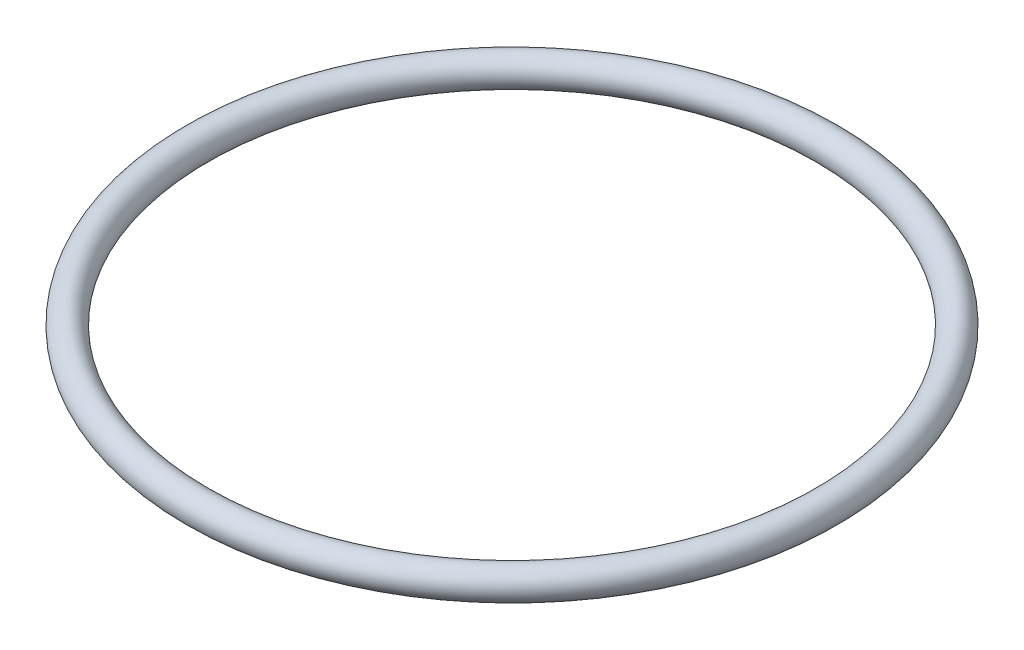
ISO-10303-21;
HEADER;
FILE_DESCRIPTION(('STEP AP214'),'2;1');
FILE_NAME('part.step','',(''),(''),'','','');
FILE_SCHEMA(('AUTOMOTIVE_DESIGN { 1 0 10303 214 1 1 1 1 }'));
ENDSEC;
DATA;
#1=APPLICATION_CONTEXT('core data for automotive mechanical design processes');
#2=APPLICATION_PROTOCOL_DEFINITION('international standard','automotive_design',2000,#1);
#3=PRODUCT_CONTEXT('',#1,'mechanical');
#4=PRODUCT('Part','Part','',(#3));
#5=PRODUCT_RELATED_PRODUCT_CATEGORY('part','',(#4));
#6=PRODUCT_DEFINITION_FORMATION('','',#4);
#7=PRODUCT_DEFINITION_CONTEXT('part definition',#1,'design');
#8=PRODUCT_DEFINITION('design','',#6,#7);
#9=PRODUCT_DEFINITION_SHAPE('','',#8);
#10=(LENGTH_UNIT() NAMED_UNIT(*) SI_UNIT(.MILLI.,.METRE.));
#11=(NAMED_UNIT(*) PLANE_ANGLE_UNIT() SI_UNIT($,.RADIAN.));
#12=(NAMED_UNIT(*) SI_UNIT($,.STERADIAN.) SOLID_ANGLE_UNIT());
#13=UNCERTAINTY_MEASURE_WITH_UNIT(LENGTH_MEASURE(1.E-05),#10,'distance_accuracy_value','');
#14=(GEOMETRIC_REPRESENTATION_CONTEXT(3) GLOBAL_UNCERTAINTY_ASSIGNED_CONTEXT((#13)) GLOBAL_UNIT_ASSIGNED_CONTEXT((#10,
#11,#12)) REPRESENTATION_CONTEXT('',''));
#15=CARTESIAN_POINT('',(0.,0.,0.));
#16=DIRECTION('',(0.,0.,1.));
#17=DIRECTION('',(1.,0.,0.));
#18=AXIS2_PLACEMENT_3D('',#15,#16,#17);
#19=CARTESIAN_POINT('',(0.,0.,0.));
#20=DIRECTION('',(0.,-1.,0.));
#21=DIRECTION('',(0.,0.,-1.));
#22=AXIS2_PLACEMENT_3D('',#19,#20,#21);
#23=TOROIDAL_SURFACE('',#22,73.025,3.49250000000001);
#24=CARTESIAN_POINT('',(0.,0.,-76.5175));
#25=VERTEX_POINT('',#24);
#26=VERTEX_LOOP('',#25);
#27=FACE_BOUND('',#26,.T.);
#28=ADVANCED_FACE('F39',(#27),#23,.T.);
#29=CLOSED_SHELL('',(#28));
#30=MANIFOLD_SOLID_BREP('B2',#29);
#31=ADVANCED_BREP_SHAPE_REPRESENTATION('',(#18,#30),#14);
#32=SHAPE_DEFINITION_REPRESENTATION(#9,#31);
ENDSEC;
END-ISO-10303-21;
